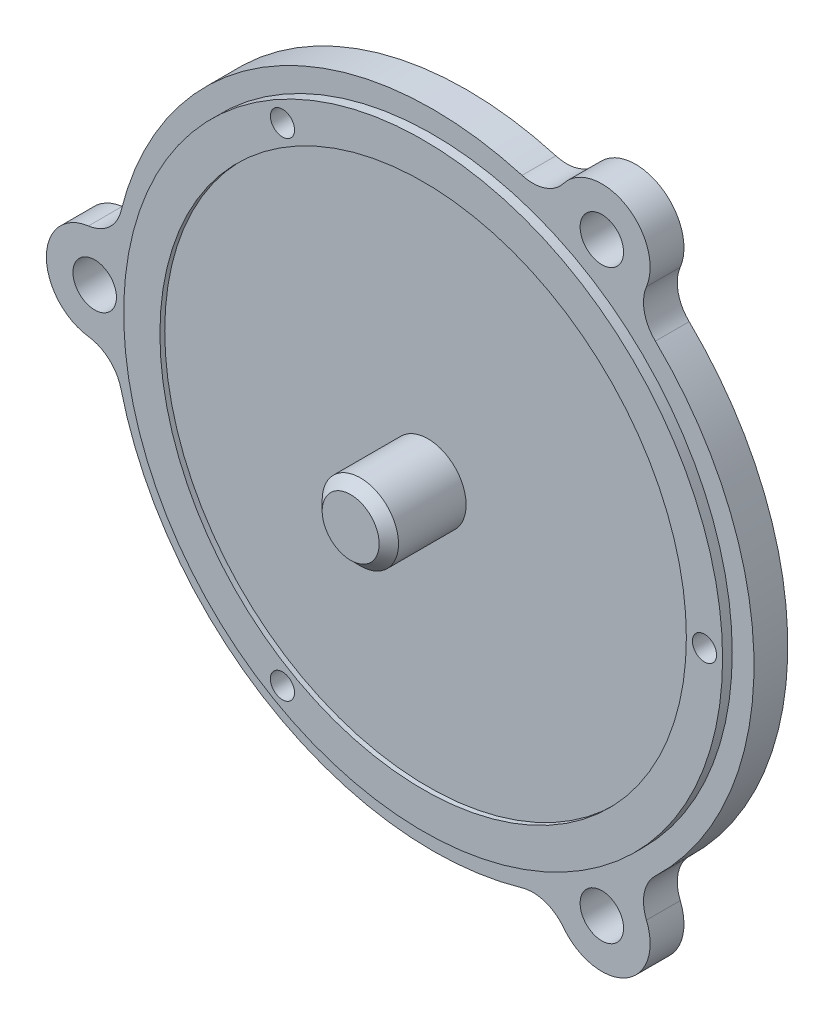
ISO-10303-21;
HEADER;
FILE_DESCRIPTION(('STEP AP214'),'2;1');
FILE_NAME('part.step','',(''),(''),'','','');
FILE_SCHEMA(('AUTOMOTIVE_DESIGN { 1 0 10303 214 1 1 1 1 }'));
ENDSEC;
DATA;
#1=APPLICATION_CONTEXT('core data for automotive mechanical design processes');
#2=APPLICATION_PROTOCOL_DEFINITION('international standard','automotive_design',2000,#1);
#3=PRODUCT_CONTEXT('',#1,'mechanical');
#4=PRODUCT('Part','Part','',(#3));
#5=PRODUCT_RELATED_PRODUCT_CATEGORY('part','',(#4));
#6=PRODUCT_DEFINITION_FORMATION('','',#4);
#7=PRODUCT_DEFINITION_CONTEXT('part definition',#1,'design');
#8=PRODUCT_DEFINITION('design','',#6,#7);
#9=PRODUCT_DEFINITION_SHAPE('','',#8);
#10=(LENGTH_UNIT() NAMED_UNIT(*) SI_UNIT(.MILLI.,.METRE.));
#11=(NAMED_UNIT(*) PLANE_ANGLE_UNIT() SI_UNIT($,.RADIAN.));
#12=(NAMED_UNIT(*) SI_UNIT($,.STERADIAN.) SOLID_ANGLE_UNIT());
#13=UNCERTAINTY_MEASURE_WITH_UNIT(LENGTH_MEASURE(1.E-05),#10,'distance_accuracy_value','');
#14=(GEOMETRIC_REPRESENTATION_CONTEXT(3) GLOBAL_UNCERTAINTY_ASSIGNED_CONTEXT((#13)) GLOBAL_UNIT_ASSIGNED_CONTEXT((#10,
#11,#12)) REPRESENTATION_CONTEXT('',''));
#15=CARTESIAN_POINT('',(0.,0.,0.));
#16=DIRECTION('',(0.,0.,1.));
#17=DIRECTION('',(1.,0.,0.));
#18=AXIS2_PLACEMENT_3D('',#15,#16,#17);
#19=CARTESIAN_POINT('',(0.,0.,2.));
#20=DIRECTION('',(0.,0.,1.));
#21=DIRECTION('',(1.,0.,0.));
#22=AXIS2_PLACEMENT_3D('',#19,#20,#21);
#23=PLANE('',#22);
#24=CARTESIAN_POINT('',(0.,0.,2.));
#25=DIRECTION('',(0.,0.,1.));
#26=DIRECTION('',(1.,0.,0.));
#27=AXIS2_PLACEMENT_3D('',#24,#25,#26);
#28=CIRCLE('',#27,3.95);
#29=CARTESIAN_POINT('',(3.95,0.,2.));
#30=VERTEX_POINT('',#29);
#31=EDGE_CURVE('E216',#30,#30,#28,.T.);
#32=ORIENTED_EDGE('',*,*,#31,.F.);
#33=EDGE_LOOP('',(#32));
#34=FACE_BOUND('',#33,.T.);
#35=CARTESIAN_POINT('',(0.,0.,2.));
#36=DIRECTION('',(0.,0.,1.));
#37=DIRECTION('',(1.,0.,0.));
#38=AXIS2_PLACEMENT_3D('',#35,#36,#37);
#39=CIRCLE('',#38,27.25);
#40=CARTESIAN_POINT('',(27.25,0.,2.));
#41=VERTEX_POINT('',#40);
#42=EDGE_CURVE('E11',#41,#41,#39,.F.);
#43=ORIENTED_EDGE('',*,*,#42,.F.);
#44=EDGE_LOOP('',(#43));
#45=FACE_BOUND('',#44,.T.);
#46=ADVANCED_FACE('F33',(#34,#45),#23,.T.);
#47=CARTESIAN_POINT('',(0.,0.,10.));
#48=DIRECTION('',(0.,0.,-1.));
#49=DIRECTION('',(-1.,0.,0.));
#50=AXIS2_PLACEMENT_3D('',#47,#48,#49);
#51=CYLINDRICAL_SURFACE('',#50,3.95);
#52=CARTESIAN_POINT('',(0.,0.,9.00000000000001));
#53=DIRECTION('',(0.,0.,1.));
#54=DIRECTION('',(1.,0.,0.));
#55=AXIS2_PLACEMENT_3D('',#52,#53,#54);
#56=CIRCLE('',#55,3.95);
#57=CARTESIAN_POINT('',(3.95,0.,9.00000000000001));
#58=VERTEX_POINT('',#57);
#59=EDGE_CURVE('E42',#58,#58,#56,.F.);
#60=ORIENTED_EDGE('',*,*,#59,.T.);
#61=EDGE_LOOP('',(#60));
#62=FACE_BOUND('',#61,.T.);
#63=ORIENTED_EDGE('',*,*,#31,.T.);
#64=EDGE_LOOP('',(#63));
#65=FACE_BOUND('',#64,.T.);
#66=ADVANCED_FACE('F250',(#62,#65),#51,.T.);
#67=CARTESIAN_POINT('',(0.,0.,10.));
#68=DIRECTION('',(0.,0.,1.));
#69=DIRECTION('',(1.,0.,0.));
#70=AXIS2_PLACEMENT_3D('',#67,#68,#69);
#71=PLANE('',#70);
#72=CARTESIAN_POINT('',(0.,0.,10.));
#73=DIRECTION('',(0.,0.,1.));
#74=DIRECTION('',(1.,0.,0.));
#75=AXIS2_PLACEMENT_3D('',#72,#73,#74);
#76=CIRCLE('',#75,2.95000000000001);
#77=CARTESIAN_POINT('',(2.95000000000001,0.,10.));
#78=VERTEX_POINT('',#77);
#79=EDGE_CURVE('E244',#78,#78,#76,.T.);
#80=ORIENTED_EDGE('',*,*,#79,.T.);
#81=EDGE_LOOP('',(#80));
#82=FACE_BOUND('',#81,.T.);
#83=ADVANCED_FACE('F256',(#82),#71,.T.);
#84=CARTESIAN_POINT('',(0.,0.,10.));
#85=DIRECTION('',(0.,0.,-1.));
#86=DIRECTION('',(-1.,0.,0.));
#87=AXIS2_PLACEMENT_3D('',#84,#85,#86);
#88=CONICAL_SURFACE('',#87,2.95000000000001,0.785398163397448);
#89=ORIENTED_EDGE('',*,*,#59,.F.);
#90=EDGE_LOOP('',(#89));
#91=FACE_BOUND('',#90,.T.);
#92=ORIENTED_EDGE('',*,*,#79,.F.);
#93=EDGE_LOOP('',(#92));
#94=FACE_BOUND('',#93,.T.);
#95=ADVANCED_FACE('F35',(#91,#94),#88,.T.);
#96=CARTESIAN_POINT('',(0.,0.,2.5));
#97=DIRECTION('',(0.,0.,1.));
#98=DIRECTION('',(1.,0.,0.));
#99=AXIS2_PLACEMENT_3D('',#96,#97,#98);
#100=PLANE('',#99);
#101=CARTESIAN_POINT('',(29.125,1.40512601554121E-13,2.5));
#102=DIRECTION('',(0.,0.,1.));
#103=DIRECTION('',(1.,0.,0.));
#104=AXIS2_PLACEMENT_3D('',#101,#102,#103);
#105=CIRCLE('',#104,1.25);
#106=CARTESIAN_POINT('',(30.375,1.40512601554121E-13,2.5));
#107=VERTEX_POINT('',#106);
#108=EDGE_CURVE('E375',#107,#107,#105,.T.);
#109=ORIENTED_EDGE('',*,*,#108,.F.);
#110=EDGE_LOOP('',(#109));
#111=FACE_BOUND('',#110,.T.);
#112=CARTESIAN_POINT('',(-14.5624999999999,-25.2229898852218,2.5));
#113=DIRECTION('',(0.,0.,1.));
#114=DIRECTION('',(1.,0.,0.));
#115=AXIS2_PLACEMENT_3D('',#112,#113,#114);
#116=CIRCLE('',#115,1.25);
#117=CARTESIAN_POINT('',(-13.3124999999999,-25.2229898852218,2.5));
#118=VERTEX_POINT('',#117);
#119=EDGE_CURVE('E369',#118,#118,#116,.T.);
#120=ORIENTED_EDGE('',*,*,#119,.F.);
#121=EDGE_LOOP('',(#120));
#122=FACE_BOUND('',#121,.T.);
#123=CARTESIAN_POINT('',(-14.5625000000001,25.2229898852217,2.5));
#124=DIRECTION('',(0.,0.,1.));
#125=DIRECTION('',(1.,0.,0.));
#126=AXIS2_PLACEMENT_3D('',#123,#124,#125);
#127=CIRCLE('',#126,1.25);
#128=CARTESIAN_POINT('',(-13.3125000000001,25.2229898852217,2.5));
#129=VERTEX_POINT('',#128);
#130=EDGE_CURVE('E363',#129,#129,#127,.T.);
#131=ORIENTED_EDGE('',*,*,#130,.F.);
#132=EDGE_LOOP('',(#131));
#133=FACE_BOUND('',#132,.T.);
#134=CARTESIAN_POINT('',(0.,0.,2.5));
#135=DIRECTION('',(0.,0.,1.));
#136=DIRECTION('',(1.,0.,0.));
#137=AXIS2_PLACEMENT_3D('',#134,#135,#136);
#138=CIRCLE('',#137,31.);
#139=CARTESIAN_POINT('',(31.,0.,2.5));
#140=VERTEX_POINT('',#139);
#141=EDGE_CURVE('E213',#140,#140,#138,.T.);
#142=ORIENTED_EDGE('',*,*,#141,.T.);
#143=EDGE_LOOP('',(#142));
#144=FACE_BOUND('',#143,.T.);
#145=CARTESIAN_POINT('',(0.,0.,2.5));
#146=DIRECTION('',(0.,0.,1.));
#147=DIRECTION('',(1.,0.,0.));
#148=AXIS2_PLACEMENT_3D('',#145,#146,#147);
#149=CIRCLE('',#148,27.25);
#150=CARTESIAN_POINT('',(27.25,0.,2.5));
#151=VERTEX_POINT('',#150);
#152=EDGE_CURVE('E210',#151,#151,#149,.T.);
#153=ORIENTED_EDGE('',*,*,#152,.F.);
#154=EDGE_LOOP('',(#153));
#155=FACE_BOUND('',#154,.T.);
#156=ADVANCED_FACE('F255',(#111,#122,#133,#144,#155),#100,.T.);
#157=CARTESIAN_POINT('',(0.,0.,2.5));
#158=DIRECTION('',(0.,0.,-1.));
#159=DIRECTION('',(-1.,0.,0.));
#160=AXIS2_PLACEMENT_3D('',#157,#158,#159);
#161=CYLINDRICAL_SURFACE('',#160,31.);
#162=ORIENTED_EDGE('',*,*,#141,.F.);
#163=EDGE_LOOP('',(#162));
#164=FACE_BOUND('',#163,.T.);
#165=CARTESIAN_POINT('',(0.,0.,1.5));
#166=DIRECTION('',(0.,0.,1.));
#167=DIRECTION('',(1.,0.,0.));
#168=AXIS2_PLACEMENT_3D('',#165,#166,#167);
#169=CIRCLE('',#168,31.);
#170=CARTESIAN_POINT('',(31.,0.,1.5));
#171=VERTEX_POINT('',#170);
#172=EDGE_CURVE('E180',#171,#171,#169,.T.);
#173=ORIENTED_EDGE('',*,*,#172,.T.);
#174=EDGE_LOOP('',(#173));
#175=FACE_BOUND('',#174,.T.);
#176=ADVANCED_FACE('F391',(#164,#175),#161,.T.);
#177=CARTESIAN_POINT('',(0.,0.,2.5));
#178=DIRECTION('',(0.,0.,-1.));
#179=DIRECTION('',(-1.,0.,0.));
#180=AXIS2_PLACEMENT_3D('',#177,#178,#179);
#181=CYLINDRICAL_SURFACE('',#180,27.25);
#182=ORIENTED_EDGE('',*,*,#152,.T.);
#183=EDGE_LOOP('',(#182));
#184=FACE_BOUND('',#183,.T.);
#185=ORIENTED_EDGE('',*,*,#42,.T.);
#186=EDGE_LOOP('',(#185));
#187=FACE_BOUND('',#186,.T.);
#188=ADVANCED_FACE('F335',(#184,#187),#181,.F.);
#189=CARTESIAN_POINT('',(-35.5825892857143,-4.4621283849942,1.5));
#190=DIRECTION('',(0.,0.,1.));
#191=DIRECTION('',(1.,0.,0.));
#192=AXIS2_PLACEMENT_3D('',#189,#190,#191);
#193=PLANE('',#192);
#194=ORIENTED_EDGE('',*,*,#172,.F.);
#195=EDGE_LOOP('',(#194));
#196=FACE_BOUND('',#195,.T.);
#197=CARTESIAN_POINT('',(-35.,0.,1.5));
#198=DIRECTION('',(0.,0.,1.));
#199=DIRECTION('',(1.,0.,0.));
#200=AXIS2_PLACEMENT_3D('',#197,#198,#199);
#201=CIRCLE('',#200,4.99999999999999);
#202=CARTESIAN_POINT('',(-35.6473214285714,4.95792042777132,1.5));
#203=VERTEX_POINT('',#202);
#204=CARTESIAN_POINT('',(-35.6473214285714,-4.95792042777132,1.5));
#205=VERTEX_POINT('',#204);
#206=EDGE_CURVE('E183',#203,#205,#201,.T.);
#207=ORIENTED_EDGE('',*,*,#206,.T.);
#208=CARTESIAN_POINT('',(-36.1651785714286,-8.92425676998839,1.5));
#209=DIRECTION('',(0.,0.,-1.));
#210=DIRECTION('',(1.,0.,0.));
#211=AXIS2_PLACEMENT_3D('',#208,#209,#210);
#212=CIRCLE('',#211,4.);
#213=CARTESIAN_POINT('',(-32.2816694630873,-7.96594731817753,1.5));
#214=VERTEX_POINT('',#213);
#215=EDGE_CURVE('E128',#205,#214,#212,.T.);
#216=ORIENTED_EDGE('',*,*,#215,.T.);
#217=CARTESIAN_POINT('',(0.,0.,1.5));
#218=DIRECTION('',(0.,0.,1.));
#219=DIRECTION('',(1.,0.,0.));
#220=AXIS2_PLACEMENT_3D('',#217,#218,#219);
#221=CIRCLE('',#220,33.25);
#222=CARTESIAN_POINT('',(9.24212198879347,-31.9397194906947,1.5));
#223=VERTEX_POINT('',#222);
#224=EDGE_CURVE('E186',#214,#223,#221,.T.);
#225=ORIENTED_EDGE('',*,*,#224,.T.);
#226=CARTESIAN_POINT('',(10.3539562130092,-35.7820917602519,1.5));
#227=DIRECTION('',(0.,0.,-1.));
#228=DIRECTION('',(1.,0.,0.));
#229=AXIS2_PLACEMENT_3D('',#226,#227,#228);
#230=CIRCLE('',#229,4.00000000000001);
#231=CARTESIAN_POINT('',(13.5299756738941,-33.3504461478978,1.5));
#232=VERTEX_POINT('',#231);
#233=EDGE_CURVE('E188',#223,#232,#230,.T.);
#234=ORIENTED_EDGE('',*,*,#233,.T.);
#235=CARTESIAN_POINT('',(17.5000000000001,-30.3108891324553,1.5));
#236=DIRECTION('',(0.,0.,1.));
#237=DIRECTION('',(1.,0.,0.));
#238=AXIS2_PLACEMENT_3D('',#235,#236,#237);
#239=CIRCLE('',#238,4.99999999999999);
#240=CARTESIAN_POINT('',(22.1173457546776,-28.3925257201265,1.5));
#241=VERTEX_POINT('',#240);
#242=EDGE_CURVE('E190',#232,#241,#239,.T.);
#243=ORIENTED_EDGE('',*,*,#242,.T.);
#244=CARTESIAN_POINT('',(25.8112223584196,-26.8578349902634,1.5));
#245=DIRECTION('',(0.,0.,-1.));
#246=DIRECTION('',(1.,0.,0.));
#247=AXIS2_PLACEMENT_3D('',#244,#245,#246);
#248=CIRCLE('',#247,4.);
#249=CARTESIAN_POINT('',(23.039547474294,-23.9737721725171,1.5));
#250=VERTEX_POINT('',#249);
#251=EDGE_CURVE('E192',#241,#250,#248,.T.);
#252=ORIENTED_EDGE('',*,*,#251,.T.);
#253=CARTESIAN_POINT('',(0.,0.,1.5));
#254=DIRECTION('',(0.,0.,1.));
#255=DIRECTION('',(1.,0.,0.));
#256=AXIS2_PLACEMENT_3D('',#253,#254,#255);
#257=CIRCLE('',#256,33.25);
#258=CARTESIAN_POINT('',(23.0395474742937,23.9737721725174,1.5));
#259=VERTEX_POINT('',#258);
#260=EDGE_CURVE('E194',#250,#259,#257,.T.);
#261=ORIENTED_EDGE('',*,*,#260,.T.);
#262=CARTESIAN_POINT('',(25.8112223584192,26.8578349902638,1.5));
#263=DIRECTION('',(0.,0.,-1.));
#264=DIRECTION('',(1.,0.,0.));
#265=AXIS2_PLACEMENT_3D('',#262,#263,#264);
#266=CIRCLE('',#265,4.);
#267=CARTESIAN_POINT('',(22.1173457546772,28.3925257201268,1.5));
#268=VERTEX_POINT('',#267);
#269=EDGE_CURVE('E196',#259,#268,#266,.T.);
#270=ORIENTED_EDGE('',*,*,#269,.T.);
#271=CARTESIAN_POINT('',(17.4999999999997,30.3108891324555,1.5));
#272=DIRECTION('',(0.,0.,1.));
#273=DIRECTION('',(1.,0.,0.));
#274=AXIS2_PLACEMENT_3D('',#271,#272,#273);
#275=CIRCLE('',#274,5.);
#276=CARTESIAN_POINT('',(13.5299756738936,33.350446147898,1.5));
#277=VERTEX_POINT('',#276);
#278=EDGE_CURVE('E198',#268,#277,#275,.T.);
#279=ORIENTED_EDGE('',*,*,#278,.T.);
#280=CARTESIAN_POINT('',(10.3539562130088,35.7820917602521,1.5));
#281=DIRECTION('',(0.,0.,-1.));
#282=DIRECTION('',(1.,0.,0.));
#283=AXIS2_PLACEMENT_3D('',#280,#281,#282);
#284=CIRCLE('',#283,4.);
#285=CARTESIAN_POINT('',(9.24212198879304,31.9397194906948,1.5));
#286=VERTEX_POINT('',#285);
#287=EDGE_CURVE('E200',#277,#286,#284,.T.);
#288=ORIENTED_EDGE('',*,*,#287,.T.);
#289=CARTESIAN_POINT('',(0.,0.,1.5));
#290=DIRECTION('',(0.,0.,1.));
#291=DIRECTION('',(1.,0.,0.));
#292=AXIS2_PLACEMENT_3D('',#289,#290,#291);
#293=CIRCLE('',#292,33.25);
#294=CARTESIAN_POINT('',(-32.2816694630873,7.96594731817756,1.5));
#295=VERTEX_POINT('',#294);
#296=EDGE_CURVE('E49',#286,#295,#293,.T.);
#297=ORIENTED_EDGE('',*,*,#296,.T.);
#298=CARTESIAN_POINT('',(-36.1651785714286,8.92425676998839,1.5));
#299=DIRECTION('',(0.,0.,-1.));
#300=DIRECTION('',(1.,0.,0.));
#301=AXIS2_PLACEMENT_3D('',#298,#299,#300);
#302=CIRCLE('',#301,4.);
#303=EDGE_CURVE('E53',#295,#203,#302,.T.);
#304=ORIENTED_EDGE('',*,*,#303,.T.);
#305=EDGE_LOOP('',(#207,#216,#225,#234,#243,#252,#261,#270,#279,#288,#297,#304));
#306=FACE_BOUND('',#305,.T.);
#307=CARTESIAN_POINT('',(17.4999999999997,30.3108891324555,1.5));
#308=DIRECTION('',(0.,0.,1.));
#309=DIRECTION('',(1.,0.,0.));
#310=AXIS2_PLACEMENT_3D('',#307,#308,#309);
#311=CIRCLE('',#310,2.25);
#312=CARTESIAN_POINT('',(19.7499999999997,30.3108891324555,1.5));
#313=VERTEX_POINT('',#312);
#314=EDGE_CURVE('E37',#313,#313,#311,.F.);
#315=ORIENTED_EDGE('',*,*,#314,.T.);
#316=EDGE_LOOP('',(#315));
#317=FACE_BOUND('',#316,.T.);
#318=CARTESIAN_POINT('',(17.5000000000001,-30.3108891324553,1.5));
#319=DIRECTION('',(0.,0.,1.));
#320=DIRECTION('',(1.,0.,0.));
#321=AXIS2_PLACEMENT_3D('',#318,#319,#320);
#322=CIRCLE('',#321,2.25);
#323=CARTESIAN_POINT('',(19.7500000000001,-30.3108891324553,1.5));
#324=VERTEX_POINT('',#323);
#325=EDGE_CURVE('E204',#324,#324,#322,.F.);
#326=ORIENTED_EDGE('',*,*,#325,.T.);
#327=EDGE_LOOP('',(#326));
#328=FACE_BOUND('',#327,.T.);
#329=CARTESIAN_POINT('',(-35.,0.,1.5));
#330=DIRECTION('',(0.,0.,1.));
#331=DIRECTION('',(1.,0.,0.));
#332=AXIS2_PLACEMENT_3D('',#329,#330,#331);
#333=CIRCLE('',#332,2.25);
#334=CARTESIAN_POINT('',(-32.75,0.,1.5));
#335=VERTEX_POINT('',#334);
#336=EDGE_CURVE('E207',#335,#335,#333,.F.);
#337=ORIENTED_EDGE('',*,*,#336,.T.);
#338=EDGE_LOOP('',(#337));
#339=FACE_BOUND('',#338,.T.);
#340=ADVANCED_FACE('F280',(#196,#306,#317,#328,#339),#193,.T.);
#341=CARTESIAN_POINT('',(-36.1651785714286,8.92425676998839,-12.24301918051));
#342=DIRECTION('',(0.,0.,-1.));
#343=DIRECTION('',(-1.,0.,0.));
#344=AXIS2_PLACEMENT_3D('',#341,#342,#343);
#345=CYLINDRICAL_SURFACE('',#344,4.);
#346=ORIENTED_EDGE('',*,*,#303,.F.);
#347=DIRECTION('',(0.,0.,1.));
#348=VECTOR('',#347,1.);
#349=CARTESIAN_POINT('',(-32.2816694630873,7.96594731817756,-94.0452018978108));
#350=LINE('',#349,#348);
#351=CARTESIAN_POINT('',(-32.2816694630872,7.96594731817756,-2.));
#352=VERTEX_POINT('',#351);
#353=EDGE_CURVE('E131',#352,#295,#350,.T.);
#354=ORIENTED_EDGE('',*,*,#353,.F.);
#355=CARTESIAN_POINT('',(-36.1651785714286,8.92425676998839,-2.));
#356=DIRECTION('',(0.,0.,1.));
#357=DIRECTION('',(-1.,0.,0.));
#358=AXIS2_PLACEMENT_3D('',#355,#356,#357);
#359=CIRCLE('',#358,4.);
#360=CARTESIAN_POINT('',(-35.6473214285714,4.95792042777133,-2.));
#361=VERTEX_POINT('',#360);
#362=EDGE_CURVE('E140',#361,#352,#359,.T.);
#363=ORIENTED_EDGE('',*,*,#362,.F.);
#364=DIRECTION('',(0.,0.,1.));
#365=VECTOR('',#364,1.);
#366=CARTESIAN_POINT('',(-35.6473214285714,4.95792042777133,-12.24301918051));
#367=LINE('',#366,#365);
#368=EDGE_CURVE('E130',#203,#361,#367,.F.);
#369=ORIENTED_EDGE('',*,*,#368,.F.);
#370=EDGE_LOOP('',(#346,#354,#363,#369));
#371=FACE_BOUND('',#370,.T.);
#372=ADVANCED_FACE('F277',(#371),#345,.F.);
#373=CARTESIAN_POINT('',(-35.,0.,-12.24301918051));
#374=DIRECTION('',(0.,0.,1.));
#375=DIRECTION('',(1.,0.,0.));
#376=AXIS2_PLACEMENT_3D('',#373,#374,#375);
#377=CYLINDRICAL_SURFACE('',#376,5.);
#378=DIRECTION('',(0.,0.,1.));
#379=VECTOR('',#378,1.);
#380=CARTESIAN_POINT('',(-35.6473214285714,-4.95792042777133,-12.24301918051));
#381=LINE('',#380,#379);
#382=CARTESIAN_POINT('',(-35.6473214285714,-4.95792042777133,-2.));
#383=VERTEX_POINT('',#382);
#384=EDGE_CURVE('E122',#383,#205,#381,.T.);
#385=ORIENTED_EDGE('',*,*,#384,.T.);
#386=ORIENTED_EDGE('',*,*,#206,.F.);
#387=ORIENTED_EDGE('',*,*,#368,.T.);
#388=CARTESIAN_POINT('',(-35.,0.,-2.));
#389=DIRECTION('',(0.,0.,-1.));
#390=DIRECTION('',(-1.,0.,0.));
#391=AXIS2_PLACEMENT_3D('',#388,#389,#390);
#392=CIRCLE('',#391,5.);
#393=EDGE_CURVE('E134',#383,#361,#392,.T.);
#394=ORIENTED_EDGE('',*,*,#393,.F.);
#395=EDGE_LOOP('',(#385,#386,#387,#394));
#396=FACE_BOUND('',#395,.T.);
#397=ADVANCED_FACE('F135',(#396),#377,.T.);
#398=CARTESIAN_POINT('',(-36.1651785714286,-8.92425676998839,-94.0452018978108));
#399=DIRECTION('',(0.,0.,-1.));
#400=DIRECTION('',(-1.,0.,0.));
#401=AXIS2_PLACEMENT_3D('',#398,#399,#400);
#402=CYLINDRICAL_SURFACE('',#401,4.);
#403=ORIENTED_EDGE('',*,*,#215,.F.);
#404=ORIENTED_EDGE('',*,*,#384,.F.);
#405=CARTESIAN_POINT('',(-36.1651785714286,-8.92425676998839,-2.));
#406=DIRECTION('',(0.,0.,1.));
#407=DIRECTION('',(-1.,0.,0.));
#408=AXIS2_PLACEMENT_3D('',#405,#406,#407);
#409=CIRCLE('',#408,4.);
#410=CARTESIAN_POINT('',(-32.2816694630872,-7.96594731817758,-2.));
#411=VERTEX_POINT('',#410);
#412=EDGE_CURVE('E127',#411,#383,#409,.T.);
#413=ORIENTED_EDGE('',*,*,#412,.F.);
#414=DIRECTION('',(0.,0.,1.));
#415=VECTOR('',#414,1.);
#416=CARTESIAN_POINT('',(-32.2816694630873,-7.96594731817756,-94.0452018978108));
#417=LINE('',#416,#415);
#418=EDGE_CURVE('E219',#214,#411,#417,.F.);
#419=ORIENTED_EDGE('',*,*,#418,.F.);
#420=EDGE_LOOP('',(#403,#404,#413,#419));
#421=FACE_BOUND('',#420,.T.);
#422=ADVANCED_FACE('F124',(#421),#402,.F.);
#423=CARTESIAN_POINT('',(0.,0.,-94.0452018978108));
#424=DIRECTION('',(0.,0.,1.));
#425=DIRECTION('',(1.,0.,0.));
#426=AXIS2_PLACEMENT_3D('',#423,#424,#425);
#427=CYLINDRICAL_SURFACE('',#426,33.25);
#428=DIRECTION('',(0.,0.,1.));
#429=VECTOR('',#428,1.);
#430=CARTESIAN_POINT('',(9.24212198879349,-31.9397194906947,-94.0452018978108));
#431=LINE('',#430,#429);
#432=CARTESIAN_POINT('',(9.24212198879349,-31.9397194906947,-2.));
#433=VERTEX_POINT('',#432);
#434=EDGE_CURVE('E224',#433,#223,#431,.T.);
#435=ORIENTED_EDGE('',*,*,#434,.T.);
#436=ORIENTED_EDGE('',*,*,#224,.F.);
#437=ORIENTED_EDGE('',*,*,#418,.T.);
#438=CARTESIAN_POINT('',(0.,0.,-2.));
#439=DIRECTION('',(0.,0.,-1.));
#440=DIRECTION('',(-1.,0.,0.));
#441=AXIS2_PLACEMENT_3D('',#438,#439,#440);
#442=CIRCLE('',#441,33.25);
#443=EDGE_CURVE('E147',#433,#411,#442,.T.);
#444=ORIENTED_EDGE('',*,*,#443,.F.);
#445=EDGE_LOOP('',(#435,#436,#437,#444));
#446=FACE_BOUND('',#445,.T.);
#447=ADVANCED_FACE('F284',(#446),#427,.T.);
#448=CARTESIAN_POINT('',(10.3539562130092,-35.7820917602519,-13.478776827522));
#449=DIRECTION('',(0.,0.,-1.));
#450=DIRECTION('',(-1.,0.,0.));
#451=AXIS2_PLACEMENT_3D('',#448,#449,#450);
#452=CYLINDRICAL_SURFACE('',#451,4.);
#453=ORIENTED_EDGE('',*,*,#233,.F.);
#454=ORIENTED_EDGE('',*,*,#434,.F.);
#455=CARTESIAN_POINT('',(10.3539562130092,-35.7820917602519,-2.));
#456=DIRECTION('',(0.,0.,1.));
#457=DIRECTION('',(-1.,0.,0.));
#458=AXIS2_PLACEMENT_3D('',#455,#456,#457);
#459=CIRCLE('',#458,4.);
#460=CARTESIAN_POINT('',(13.5299756738941,-33.3504461478979,-2.));
#461=VERTEX_POINT('',#460);
#462=EDGE_CURVE('E177',#461,#433,#459,.T.);
#463=ORIENTED_EDGE('',*,*,#462,.F.);
#464=DIRECTION('',(0.,0.,1.));
#465=VECTOR('',#464,1.);
#466=CARTESIAN_POINT('',(13.5299756738941,-33.3504461478979,-13.478776827522));
#467=LINE('',#466,#465);
#468=EDGE_CURVE('E230',#232,#461,#467,.F.);
#469=ORIENTED_EDGE('',*,*,#468,.F.);
#470=EDGE_LOOP('',(#453,#454,#463,#469));
#471=FACE_BOUND('',#470,.T.);
#472=ADVANCED_FACE('F285',(#471),#452,.F.);
#473=CARTESIAN_POINT('',(17.5000000000001,-30.3108891324553,-13.478776827522));
#474=DIRECTION('',(0.,0.,1.));
#475=DIRECTION('',(1.,0.,0.));
#476=AXIS2_PLACEMENT_3D('',#473,#474,#475);
#477=CYLINDRICAL_SURFACE('',#476,5.);
#478=DIRECTION('',(0.,0.,1.));
#479=VECTOR('',#478,1.);
#480=CARTESIAN_POINT('',(22.1173457546776,-28.3925257201265,-13.478776827522));
#481=LINE('',#480,#479);
#482=CARTESIAN_POINT('',(22.1173457546776,-28.3925257201265,-2.));
#483=VERTEX_POINT('',#482);
#484=EDGE_CURVE('E227',#483,#241,#481,.T.);
#485=ORIENTED_EDGE('',*,*,#484,.T.);
#486=ORIENTED_EDGE('',*,*,#242,.F.);
#487=ORIENTED_EDGE('',*,*,#468,.T.);
#488=CARTESIAN_POINT('',(17.5000000000001,-30.3108891324553,-2.));
#489=DIRECTION('',(0.,0.,-1.));
#490=DIRECTION('',(-1.,0.,0.));
#491=AXIS2_PLACEMENT_3D('',#488,#489,#490);
#492=CIRCLE('',#491,5.);
#493=EDGE_CURVE('E174',#483,#461,#492,.T.);
#494=ORIENTED_EDGE('',*,*,#493,.F.);
#495=EDGE_LOOP('',(#485,#486,#487,#494));
#496=FACE_BOUND('',#495,.T.);
#497=ADVANCED_FACE('F288',(#496),#477,.T.);
#498=CARTESIAN_POINT('',(25.8112223584196,-26.8578349902634,-94.0452018978108));
#499=DIRECTION('',(0.,0.,-1.));
#500=DIRECTION('',(-1.,0.,0.));
#501=AXIS2_PLACEMENT_3D('',#498,#499,#500);
#502=CYLINDRICAL_SURFACE('',#501,4.);
#503=ORIENTED_EDGE('',*,*,#251,.F.);
#504=ORIENTED_EDGE('',*,*,#484,.F.);
#505=CARTESIAN_POINT('',(25.8112223584196,-26.8578349902634,-2.));
#506=DIRECTION('',(0.,0.,1.));
#507=DIRECTION('',(-1.,0.,0.));
#508=AXIS2_PLACEMENT_3D('',#505,#506,#507);
#509=CIRCLE('',#508,4.);
#510=CARTESIAN_POINT('',(23.039547474294,-23.973772172517,-2.));
#511=VERTEX_POINT('',#510);
#512=EDGE_CURVE('E171',#511,#483,#509,.T.);
#513=ORIENTED_EDGE('',*,*,#512,.F.);
#514=DIRECTION('',(0.,0.,1.));
#515=VECTOR('',#514,1.);
#516=CARTESIAN_POINT('',(23.039547474294,-23.973772172517,-94.0452018978108));
#517=LINE('',#516,#515);
#518=EDGE_CURVE('E232',#250,#511,#517,.F.);
#519=ORIENTED_EDGE('',*,*,#518,.F.);
#520=EDGE_LOOP('',(#503,#504,#513,#519));
#521=FACE_BOUND('',#520,.T.);
#522=ADVANCED_FACE('F290',(#521),#502,.F.);
#523=DIRECTION('',(0.,0.,1.));
#524=VECTOR('',#523,1.);
#525=CARTESIAN_POINT('',(23.0395474742937,23.9737721725174,-94.0452018978108));
#526=LINE('',#525,#524);
#527=CARTESIAN_POINT('',(23.0395474742937,23.9737721725174,-2.));
#528=VERTEX_POINT('',#527);
#529=EDGE_CURVE('E234',#528,#259,#526,.T.);
#530=ORIENTED_EDGE('',*,*,#529,.T.);
#531=ORIENTED_EDGE('',*,*,#260,.F.);
#532=ORIENTED_EDGE('',*,*,#518,.T.);
#533=CARTESIAN_POINT('',(0.,0.,-2.));
#534=DIRECTION('',(0.,0.,-1.));
#535=DIRECTION('',(-1.,0.,0.));
#536=AXIS2_PLACEMENT_3D('',#533,#534,#535);
#537=CIRCLE('',#536,33.25);
#538=EDGE_CURVE('E168',#528,#511,#537,.T.);
#539=ORIENTED_EDGE('',*,*,#538,.F.);
#540=EDGE_LOOP('',(#530,#531,#532,#539));
#541=FACE_BOUND('',#540,.T.);
#542=ADVANCED_FACE('F293',(#541),#427,.T.);
#543=CARTESIAN_POINT('',(25.8112223584192,26.8578349902638,-13.478776827522));
#544=DIRECTION('',(0.,0.,-1.));
#545=DIRECTION('',(-1.,0.,0.));
#546=AXIS2_PLACEMENT_3D('',#543,#544,#545);
#547=CYLINDRICAL_SURFACE('',#546,4.);
#548=ORIENTED_EDGE('',*,*,#269,.F.);
#549=ORIENTED_EDGE('',*,*,#529,.F.);
#550=CARTESIAN_POINT('',(25.8112223584192,26.8578349902638,-2.));
#551=DIRECTION('',(0.,0.,1.));
#552=DIRECTION('',(-1.,0.,0.));
#553=AXIS2_PLACEMENT_3D('',#550,#551,#552);
#554=CIRCLE('',#553,4.);
#555=CARTESIAN_POINT('',(22.1173457546772,28.3925257201268,-2.));
#556=VERTEX_POINT('',#555);
#557=EDGE_CURVE('E165',#556,#528,#554,.T.);
#558=ORIENTED_EDGE('',*,*,#557,.F.);
#559=DIRECTION('',(0.,0.,1.));
#560=VECTOR('',#559,1.);
#561=CARTESIAN_POINT('',(22.1173457546772,28.3925257201268,-13.478776827522));
#562=LINE('',#561,#560);
#563=EDGE_CURVE('E240',#268,#556,#562,.F.);
#564=ORIENTED_EDGE('',*,*,#563,.F.);
#565=EDGE_LOOP('',(#548,#549,#558,#564));
#566=FACE_BOUND('',#565,.T.);
#567=ADVANCED_FACE('F295',(#566),#547,.F.);
#568=CARTESIAN_POINT('',(17.4999999999997,30.3108891324555,-13.478776827522));
#569=DIRECTION('',(0.,0.,1.));
#570=DIRECTION('',(1.,0.,0.));
#571=AXIS2_PLACEMENT_3D('',#568,#569,#570);
#572=CYLINDRICAL_SURFACE('',#571,5.);
#573=DIRECTION('',(0.,0.,1.));
#574=VECTOR('',#573,1.);
#575=CARTESIAN_POINT('',(13.5299756738936,33.350446147898,-13.478776827522));
#576=LINE('',#575,#574);
#577=CARTESIAN_POINT('',(13.5299756738936,33.350446147898,-2.));
#578=VERTEX_POINT('',#577);
#579=EDGE_CURVE('E237',#578,#277,#576,.T.);
#580=ORIENTED_EDGE('',*,*,#579,.T.);
#581=ORIENTED_EDGE('',*,*,#278,.F.);
#582=ORIENTED_EDGE('',*,*,#563,.T.);
#583=CARTESIAN_POINT('',(17.4999999999997,30.3108891324555,-2.));
#584=DIRECTION('',(0.,0.,-1.));
#585=DIRECTION('',(-1.,0.,0.));
#586=AXIS2_PLACEMENT_3D('',#583,#584,#585);
#587=CIRCLE('',#586,5.);
#588=EDGE_CURVE('E162',#578,#556,#587,.T.);
#589=ORIENTED_EDGE('',*,*,#588,.F.);
#590=EDGE_LOOP('',(#580,#581,#582,#589));
#591=FACE_BOUND('',#590,.T.);
#592=ADVANCED_FACE('F297',(#591),#572,.T.);
#593=CARTESIAN_POINT('',(10.3539562130088,35.7820917602521,-94.0452018978108));
#594=DIRECTION('',(0.,0.,-1.));
#595=DIRECTION('',(-1.,0.,0.));
#596=AXIS2_PLACEMENT_3D('',#593,#594,#595);
#597=CYLINDRICAL_SURFACE('',#596,4.);
#598=ORIENTED_EDGE('',*,*,#287,.F.);
#599=ORIENTED_EDGE('',*,*,#579,.F.);
#600=CARTESIAN_POINT('',(10.3539562130088,35.7820917602521,-2.));
#601=DIRECTION('',(0.,0.,1.));
#602=DIRECTION('',(-1.,0.,0.));
#603=AXIS2_PLACEMENT_3D('',#600,#601,#602);
#604=CIRCLE('',#603,4.);
#605=CARTESIAN_POINT('',(9.24212198879305,31.9397194906948,-2.));
#606=VERTEX_POINT('',#605);
#607=EDGE_CURVE('E159',#606,#578,#604,.T.);
#608=ORIENTED_EDGE('',*,*,#607,.F.);
#609=DIRECTION('',(0.,0.,1.));
#610=VECTOR('',#609,1.);
#611=CARTESIAN_POINT('',(9.24212198879304,31.9397194906948,-94.0452018978108));
#612=LINE('',#611,#610);
#613=EDGE_CURVE('E242',#286,#606,#612,.F.);
#614=ORIENTED_EDGE('',*,*,#613,.F.);
#615=EDGE_LOOP('',(#598,#599,#608,#614));
#616=FACE_BOUND('',#615,.T.);
#617=ADVANCED_FACE('F299',(#616),#597,.F.);
#618=ORIENTED_EDGE('',*,*,#353,.T.);
#619=ORIENTED_EDGE('',*,*,#296,.F.);
#620=ORIENTED_EDGE('',*,*,#613,.T.);
#621=CARTESIAN_POINT('',(0.,0.,-2.));
#622=DIRECTION('',(0.,0.,-1.));
#623=DIRECTION('',(-1.,0.,0.));
#624=AXIS2_PLACEMENT_3D('',#621,#622,#623);
#625=CIRCLE('',#624,33.25);
#626=EDGE_CURVE('E156',#352,#606,#625,.T.);
#627=ORIENTED_EDGE('',*,*,#626,.F.);
#628=EDGE_LOOP('',(#618,#619,#620,#627));
#629=FACE_BOUND('',#628,.T.);
#630=ADVANCED_FACE('F275',(#629),#427,.T.);
#631=CARTESIAN_POINT('',(-35.,0.,0.));
#632=DIRECTION('',(0.,0.,1.));
#633=DIRECTION('',(1.,0.,0.));
#634=AXIS2_PLACEMENT_3D('',#631,#632,#633);
#635=CYLINDRICAL_SURFACE('',#634,2.25);
#636=ORIENTED_EDGE('',*,*,#336,.F.);
#637=EDGE_LOOP('',(#636));
#638=FACE_BOUND('',#637,.T.);
#639=CARTESIAN_POINT('',(-35.,0.,-2.));
#640=DIRECTION('',(0.,0.,-1.));
#641=DIRECTION('',(-1.,0.,0.));
#642=AXIS2_PLACEMENT_3D('',#639,#640,#641);
#643=CIRCLE('',#642,2.25);
#644=CARTESIAN_POINT('',(-37.25,0.,-2.));
#645=VERTEX_POINT('',#644);
#646=EDGE_CURVE('E148',#645,#645,#643,.T.);
#647=ORIENTED_EDGE('',*,*,#646,.T.);
#648=EDGE_LOOP('',(#647));
#649=FACE_BOUND('',#648,.T.);
#650=ADVANCED_FACE('F306',(#638,#649),#635,.F.);
#651=CARTESIAN_POINT('',(17.5000000000001,-30.3108891324553,0.));
#652=DIRECTION('',(0.,0.,1.));
#653=DIRECTION('',(1.,0.,0.));
#654=AXIS2_PLACEMENT_3D('',#651,#652,#653);
#655=CYLINDRICAL_SURFACE('',#654,2.25);
#656=ORIENTED_EDGE('',*,*,#325,.F.);
#657=EDGE_LOOP('',(#656));
#658=FACE_BOUND('',#657,.T.);
#659=CARTESIAN_POINT('',(17.5000000000001,-30.3108891324553,-2.));
#660=DIRECTION('',(0.,0.,-1.));
#661=DIRECTION('',(-1.,0.,0.));
#662=AXIS2_PLACEMENT_3D('',#659,#660,#661);
#663=CIRCLE('',#662,2.25);
#664=CARTESIAN_POINT('',(15.2500000000001,-30.3108891324553,-2.));
#665=VERTEX_POINT('',#664);
#666=EDGE_CURVE('E151',#665,#665,#663,.T.);
#667=ORIENTED_EDGE('',*,*,#666,.T.);
#668=EDGE_LOOP('',(#667));
#669=FACE_BOUND('',#668,.T.);
#670=ADVANCED_FACE('F347',(#658,#669),#655,.F.);
#671=CARTESIAN_POINT('',(17.4999999999997,30.3108891324555,0.));
#672=DIRECTION('',(0.,0.,1.));
#673=DIRECTION('',(1.,0.,0.));
#674=AXIS2_PLACEMENT_3D('',#671,#672,#673);
#675=CYLINDRICAL_SURFACE('',#674,2.25);
#676=ORIENTED_EDGE('',*,*,#314,.F.);
#677=EDGE_LOOP('',(#676));
#678=FACE_BOUND('',#677,.T.);
#679=CARTESIAN_POINT('',(17.4999999999997,30.3108891324555,-2.));
#680=DIRECTION('',(0.,0.,-1.));
#681=DIRECTION('',(-1.,0.,0.));
#682=AXIS2_PLACEMENT_3D('',#679,#680,#681);
#683=CIRCLE('',#682,2.25);
#684=CARTESIAN_POINT('',(15.2499999999997,30.3108891324555,-2.));
#685=VERTEX_POINT('',#684);
#686=EDGE_CURVE('E357',#685,#685,#683,.T.);
#687=ORIENTED_EDGE('',*,*,#686,.T.);
#688=EDGE_LOOP('',(#687));
#689=FACE_BOUND('',#688,.T.);
#690=ADVANCED_FACE('F352',(#678,#689),#675,.F.);
#691=CARTESIAN_POINT('',(-18.0825892857143,-4.4621283849942,-2.));
#692=DIRECTION('',(0.,0.,-1.));
#693=DIRECTION('',(-1.,0.,0.));
#694=AXIS2_PLACEMENT_3D('',#691,#692,#693);
#695=PLANE('',#694);
#696=CARTESIAN_POINT('',(29.125,1.40512601554121E-13,-2.));
#697=DIRECTION('',(0.,0.,1.));
#698=DIRECTION('',(1.,0.,0.));
#699=AXIS2_PLACEMENT_3D('',#696,#697,#698);
#700=CIRCLE('',#699,1.25);
#701=CARTESIAN_POINT('',(30.375,1.40512601554121E-13,-2.));
#702=VERTEX_POINT('',#701);
#703=EDGE_CURVE('E367',#702,#702,#700,.T.);
#704=ORIENTED_EDGE('',*,*,#703,.T.);
#705=EDGE_LOOP('',(#704));
#706=FACE_BOUND('',#705,.T.);
#707=CARTESIAN_POINT('',(-14.5624999999999,-25.2229898852218,-2.));
#708=DIRECTION('',(0.,0.,1.));
#709=DIRECTION('',(1.,0.,0.));
#710=AXIS2_PLACEMENT_3D('',#707,#708,#709);
#711=CIRCLE('',#710,1.25);
#712=CARTESIAN_POINT('',(-13.3124999999999,-25.2229898852218,-2.));
#713=VERTEX_POINT('',#712);
#714=EDGE_CURVE('E372',#713,#713,#711,.T.);
#715=ORIENTED_EDGE('',*,*,#714,.T.);
#716=EDGE_LOOP('',(#715));
#717=FACE_BOUND('',#716,.T.);
#718=CARTESIAN_POINT('',(-14.5625000000001,25.2229898852217,-2.));
#719=DIRECTION('',(0.,0.,1.));
#720=DIRECTION('',(1.,0.,0.));
#721=AXIS2_PLACEMENT_3D('',#718,#719,#720);
#722=CIRCLE('',#721,1.25);
#723=CARTESIAN_POINT('',(-13.3125000000001,25.2229898852217,-2.));
#724=VERTEX_POINT('',#723);
#725=EDGE_CURVE('E359',#724,#724,#722,.T.);
#726=ORIENTED_EDGE('',*,*,#725,.T.);
#727=EDGE_LOOP('',(#726));
#728=FACE_BOUND('',#727,.T.);
#729=ORIENTED_EDGE('',*,*,#666,.F.);
#730=EDGE_LOOP('',(#729));
#731=FACE_BOUND('',#730,.T.);
#732=ORIENTED_EDGE('',*,*,#412,.T.);
#733=ORIENTED_EDGE('',*,*,#393,.T.);
#734=ORIENTED_EDGE('',*,*,#362,.T.);
#735=ORIENTED_EDGE('',*,*,#626,.T.);
#736=ORIENTED_EDGE('',*,*,#607,.T.);
#737=ORIENTED_EDGE('',*,*,#588,.T.);
#738=ORIENTED_EDGE('',*,*,#557,.T.);
#739=ORIENTED_EDGE('',*,*,#538,.T.);
#740=ORIENTED_EDGE('',*,*,#512,.T.);
#741=ORIENTED_EDGE('',*,*,#493,.T.);
#742=ORIENTED_EDGE('',*,*,#462,.T.);
#743=ORIENTED_EDGE('',*,*,#443,.T.);
#744=EDGE_LOOP('',(#732,#733,#734,#735,#736,#737,#738,#739,#740,#741,#742,#743));
#745=FACE_BOUND('',#744,.T.);
#746=ORIENTED_EDGE('',*,*,#646,.F.);
#747=EDGE_LOOP('',(#746));
#748=FACE_BOUND('',#747,.T.);
#749=ORIENTED_EDGE('',*,*,#686,.F.);
#750=EDGE_LOOP('',(#749));
#751=FACE_BOUND('',#750,.T.);
#752=ADVANCED_FACE('F143',(#706,#717,#728,#731,#745,#748,#751),#695,.T.);
#753=CARTESIAN_POINT('',(-14.5625000000001,25.2229898852217,-2.));
#754=DIRECTION('',(0.,0.,1.));
#755=DIRECTION('',(1.,0.,0.));
#756=AXIS2_PLACEMENT_3D('',#753,#754,#755);
#757=CYLINDRICAL_SURFACE('',#756,1.25);
#758=ORIENTED_EDGE('',*,*,#725,.F.);
#759=EDGE_LOOP('',(#758));
#760=FACE_BOUND('',#759,.T.);
#761=ORIENTED_EDGE('',*,*,#130,.T.);
#762=EDGE_LOOP('',(#761));
#763=FACE_BOUND('',#762,.T.);
#764=ADVANCED_FACE('F351',(#760,#763),#757,.F.);
#765=CARTESIAN_POINT('',(-14.5624999999999,-25.2229898852218,-2.));
#766=DIRECTION('',(0.,0.,1.));
#767=DIRECTION('',(1.,0.,0.));
#768=AXIS2_PLACEMENT_3D('',#765,#766,#767);
#769=CYLINDRICAL_SURFACE('',#768,1.25);
#770=ORIENTED_EDGE('',*,*,#714,.F.);
#771=EDGE_LOOP('',(#770));
#772=FACE_BOUND('',#771,.T.);
#773=ORIENTED_EDGE('',*,*,#119,.T.);
#774=EDGE_LOOP('',(#773));
#775=FACE_BOUND('',#774,.T.);
#776=ADVANCED_FACE('F385',(#772,#775),#769,.F.);
#777=CARTESIAN_POINT('',(29.125,1.40512601554121E-13,-2.));
#778=DIRECTION('',(0.,0.,1.));
#779=DIRECTION('',(1.,0.,0.));
#780=AXIS2_PLACEMENT_3D('',#777,#778,#779);
#781=CYLINDRICAL_SURFACE('',#780,1.25);
#782=ORIENTED_EDGE('',*,*,#703,.F.);
#783=EDGE_LOOP('',(#782));
#784=FACE_BOUND('',#783,.T.);
#785=ORIENTED_EDGE('',*,*,#108,.T.);
#786=EDGE_LOOP('',(#785));
#787=FACE_BOUND('',#786,.T.);
#788=ADVANCED_FACE('F382',(#784,#787),#781,.F.);
#789=CLOSED_SHELL('',(#46,#66,#83,#95,#156,#176,#188,#340,#372,#397,#422,#447,#472,#497,#522,
#542,#567,#592,#617,#630,#650,#670,#690,#752,#764,#776,#788));
#790=MANIFOLD_SOLID_BREP('B2',#789);
#791=ADVANCED_BREP_SHAPE_REPRESENTATION('',(#18,#790),#14);
#792=SHAPE_DEFINITION_REPRESENTATION(#9,#791);
ENDSEC;
END-ISO-10303-21;
